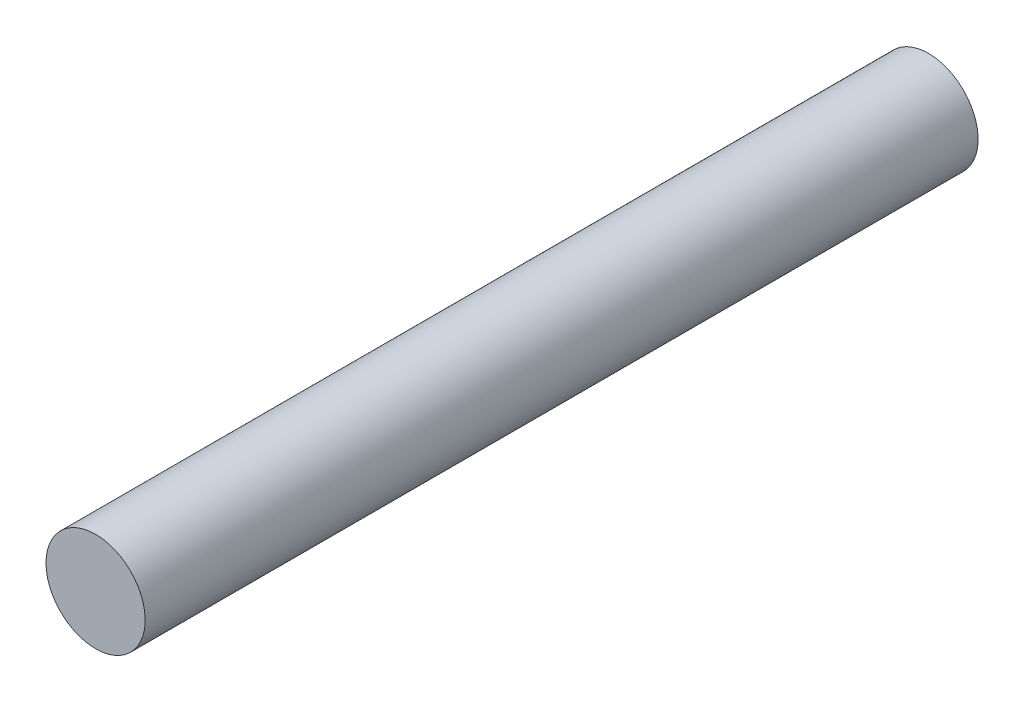
ISO-10303-21;
HEADER;
FILE_DESCRIPTION(('STEP AP214'),'2;1');
FILE_NAME('part.step','',(''),(''),'','','');
FILE_SCHEMA(('AUTOMOTIVE_DESIGN { 1 0 10303 214 1 1 1 1 }'));
ENDSEC;
DATA;
#1=APPLICATION_CONTEXT('core data for automotive mechanical design processes');
#2=APPLICATION_PROTOCOL_DEFINITION('international standard','automotive_design',2000,#1);
#3=PRODUCT_CONTEXT('',#1,'mechanical');
#4=PRODUCT('Part','Part','',(#3));
#5=PRODUCT_RELATED_PRODUCT_CATEGORY('part','',(#4));
#6=PRODUCT_DEFINITION_FORMATION('','',#4);
#7=PRODUCT_DEFINITION_CONTEXT('part definition',#1,'design');
#8=PRODUCT_DEFINITION('design','',#6,#7);
#9=PRODUCT_DEFINITION_SHAPE('','',#8);
#10=(LENGTH_UNIT() NAMED_UNIT(*) SI_UNIT(.MILLI.,.METRE.));
#11=(NAMED_UNIT(*) PLANE_ANGLE_UNIT() SI_UNIT($,.RADIAN.));
#12=(NAMED_UNIT(*) SI_UNIT($,.STERADIAN.) SOLID_ANGLE_UNIT());
#13=UNCERTAINTY_MEASURE_WITH_UNIT(LENGTH_MEASURE(1.E-05),#10,'distance_accuracy_value','');
#14=(GEOMETRIC_REPRESENTATION_CONTEXT(3) GLOBAL_UNCERTAINTY_ASSIGNED_CONTEXT((#13)) GLOBAL_UNIT_ASSIGNED_CONTEXT((#10,
#11,#12)) REPRESENTATION_CONTEXT('',''));
#15=CARTESIAN_POINT('',(0.,0.,0.));
#16=DIRECTION('',(0.,0.,1.));
#17=DIRECTION('',(1.,0.,0.));
#18=AXIS2_PLACEMENT_3D('',#15,#16,#17);
#19=CARTESIAN_POINT('',(0.,0.,84.));
#20=DIRECTION('',(0.,0.,-1.));
#21=DIRECTION('',(-1.,0.,0.));
#22=AXIS2_PLACEMENT_3D('',#19,#20,#21);
#23=CYLINDRICAL_SURFACE('',#22,5.);
#24=CARTESIAN_POINT('',(0.,0.,84.));
#25=DIRECTION('',(0.,0.,1.));
#26=DIRECTION('',(1.,0.,0.));
#27=AXIS2_PLACEMENT_3D('',#24,#25,#26);
#28=CIRCLE('',#27,5.);
#29=CARTESIAN_POINT('',(-5.,0.,84.));
#30=VERTEX_POINT('',#29);
#31=EDGE_CURVE('E10',#30,#30,#28,.T.);
#32=CARTESIAN_POINT('',(0.,0.,0.));
#33=DIRECTION('',(0.,0.,1.));
#34=DIRECTION('',(1.,0.,0.));
#35=AXIS2_PLACEMENT_3D('',#32,#33,#34);
#36=CIRCLE('',#35,5.);
#37=CARTESIAN_POINT('',(-5.,0.,0.));
#38=VERTEX_POINT('',#37);
#39=EDGE_CURVE('E36',#38,#38,#36,.T.);
#40=CARTESIAN_POINT('',(-5.,0.,84.));
#41=CARTESIAN_POINT('',(-5.,0.,83.125));
#42=CARTESIAN_POINT('',(-5.,0.,82.25));
#43=CARTESIAN_POINT('',(-5.,0.,80.5));
#44=CARTESIAN_POINT('',(-5.,0.,79.625));
#45=CARTESIAN_POINT('',(-5.,0.,77.875));
#46=CARTESIAN_POINT('',(-5.,0.,77.));
#47=CARTESIAN_POINT('',(-5.,0.,75.25));
#48=CARTESIAN_POINT('',(-5.,0.,74.375));
#49=CARTESIAN_POINT('',(-5.,0.,72.625));
#50=CARTESIAN_POINT('',(-5.,0.,71.75));
#51=CARTESIAN_POINT('',(-5.,0.,70.));
#52=CARTESIAN_POINT('',(-5.,0.,69.125));
#53=CARTESIAN_POINT('',(-5.,0.,67.375));
#54=CARTESIAN_POINT('',(-5.,0.,66.5));
#55=CARTESIAN_POINT('',(-5.,0.,64.75));
#56=CARTESIAN_POINT('',(-5.,0.,63.875));
#57=CARTESIAN_POINT('',(-5.,0.,62.125));
#58=CARTESIAN_POINT('',(-5.,0.,61.25));
#59=CARTESIAN_POINT('',(-5.,0.,59.5));
#60=CARTESIAN_POINT('',(-5.,0.,58.625));
#61=CARTESIAN_POINT('',(-5.,0.,56.875));
#62=CARTESIAN_POINT('',(-5.,0.,56.));
#63=CARTESIAN_POINT('',(-5.,0.,54.25));
#64=CARTESIAN_POINT('',(-5.,0.,53.375));
#65=CARTESIAN_POINT('',(-5.,0.,51.625));
#66=CARTESIAN_POINT('',(-5.,0.,50.75));
#67=CARTESIAN_POINT('',(-5.,0.,49.));
#68=CARTESIAN_POINT('',(-5.,0.,48.125));
#69=CARTESIAN_POINT('',(-5.,0.,46.375));
#70=CARTESIAN_POINT('',(-5.,0.,45.5));
#71=CARTESIAN_POINT('',(-5.,0.,43.75));
#72=CARTESIAN_POINT('',(-5.,0.,42.875));
#73=CARTESIAN_POINT('',(-5.,0.,41.125));
#74=CARTESIAN_POINT('',(-5.,0.,40.25));
#75=CARTESIAN_POINT('',(-5.,0.,38.5));
#76=CARTESIAN_POINT('',(-5.,0.,37.625));
#77=CARTESIAN_POINT('',(-5.,0.,35.875));
#78=CARTESIAN_POINT('',(-5.,0.,35.));
#79=CARTESIAN_POINT('',(-5.,0.,33.25));
#80=CARTESIAN_POINT('',(-5.,0.,32.375));
#81=CARTESIAN_POINT('',(-5.,0.,30.625));
#82=CARTESIAN_POINT('',(-5.,0.,29.75));
#83=CARTESIAN_POINT('',(-5.,0.,28.));
#84=CARTESIAN_POINT('',(-5.,0.,27.125));
#85=CARTESIAN_POINT('',(-5.,0.,25.375));
#86=CARTESIAN_POINT('',(-5.,0.,24.5));
#87=CARTESIAN_POINT('',(-5.,0.,22.75));
#88=CARTESIAN_POINT('',(-5.,0.,21.875));
#89=CARTESIAN_POINT('',(-5.,0.,20.125));
#90=CARTESIAN_POINT('',(-5.,0.,19.25));
#91=CARTESIAN_POINT('',(-5.,0.,17.5));
#92=CARTESIAN_POINT('',(-5.,0.,16.625));
#93=CARTESIAN_POINT('',(-5.,0.,14.875));
#94=CARTESIAN_POINT('',(-5.,0.,14.));
#95=CARTESIAN_POINT('',(-5.,0.,12.25));
#96=CARTESIAN_POINT('',(-5.,0.,11.375));
#97=CARTESIAN_POINT('',(-5.,0.,9.62500000000001));
#98=CARTESIAN_POINT('',(-5.,0.,8.75000000000001));
#99=CARTESIAN_POINT('',(-5.,0.,7.00000000000001));
#100=CARTESIAN_POINT('',(-5.,0.,6.12500000000001));
#101=CARTESIAN_POINT('',(-5.,0.,4.375));
#102=CARTESIAN_POINT('',(-5.,0.,3.5));
#103=CARTESIAN_POINT('',(-5.,0.,1.75));
#104=CARTESIAN_POINT('',(-5.,0.,0.875));
#105=CARTESIAN_POINT('',(-5.,0.,0.));
#106=B_SPLINE_CURVE_WITH_KNOTS('',3,(#40,#41,#42,#43,#44,#45,#46,#47,#48,#49,#50,#51,#52,#53,
#54,#55,#56,#57,#58,#59,#60,#61,#62,#63,#64,#65,#66,#67,#68,#69,#70,#71,#72,#73,#74,#75,#76,#77,
#78,#79,#80,#81,#82,#83,#84,#85,#86,#87,#88,#89,#90,#91,#92,#93,#94,#95,#96,#97,#98,#99,#100,
#101,#102,#103,#104,#105),.UNSPECIFIED.,.F.,.F.,(4,2,2,2,2,2,2,2,2,2,2,2,2,2,2,2,2,2,2,2,2,2,2,
2,2,2,2,2,2,2,2,2,4),(0.,2.625,5.25,7.87500000000001,10.5,13.125,15.75,18.375,21.,23.625,26.25,
28.875,31.5,34.125,36.75,39.375,42.,44.625,47.25,49.875,52.5,55.125,57.75,60.375,63.,65.625,
68.25,70.875,73.5,76.125,78.75,81.375,84.),.UNSPECIFIED.);
#107=EDGE_CURVE('BSEAM33',#30,#38,#106,.T.);
#108=ORIENTED_EDGE('',*,*,#31,.F.);
#109=ORIENTED_EDGE('',*,*,#39,.T.);
#110=ORIENTED_EDGE('',*,*,#107,.T.);
#111=ORIENTED_EDGE('',*,*,#107,.F.);
#112=EDGE_LOOP('',(#108,#110,#109,#111));
#113=FACE_BOUND('',#112,.T.);
#114=ADVANCED_FACE('F33',(#113),#23,.T.);
#115=CARTESIAN_POINT('',(0.,0.,84.));
#116=DIRECTION('',(0.,0.,1.));
#117=DIRECTION('',(1.,0.,0.));
#118=AXIS2_PLACEMENT_3D('',#115,#116,#117);
#119=PLANE('',#118);
#120=ORIENTED_EDGE('',*,*,#31,.T.);
#121=EDGE_LOOP('',(#120));
#122=FACE_BOUND('',#121,.T.);
#123=ADVANCED_FACE('F48',(#122),#119,.T.);
#124=CARTESIAN_POINT('',(0.,0.,0.));
#125=DIRECTION('',(0.,0.,1.));
#126=DIRECTION('',(1.,0.,0.));
#127=AXIS2_PLACEMENT_3D('',#124,#125,#126);
#128=PLANE('',#127);
#129=ORIENTED_EDGE('',*,*,#39,.F.);
#130=EDGE_LOOP('',(#129));
#131=FACE_BOUND('',#130,.T.);
#132=ADVANCED_FACE('F46',(#131),#128,.F.);
#133=CLOSED_SHELL('',(#114,#123,#132));
#134=MANIFOLD_SOLID_BREP('B2',#133);
#135=ADVANCED_BREP_SHAPE_REPRESENTATION('',(#18,#134),#14);
#136=SHAPE_DEFINITION_REPRESENTATION(#9,#135);
ENDSEC;
END-ISO-10303-21;
